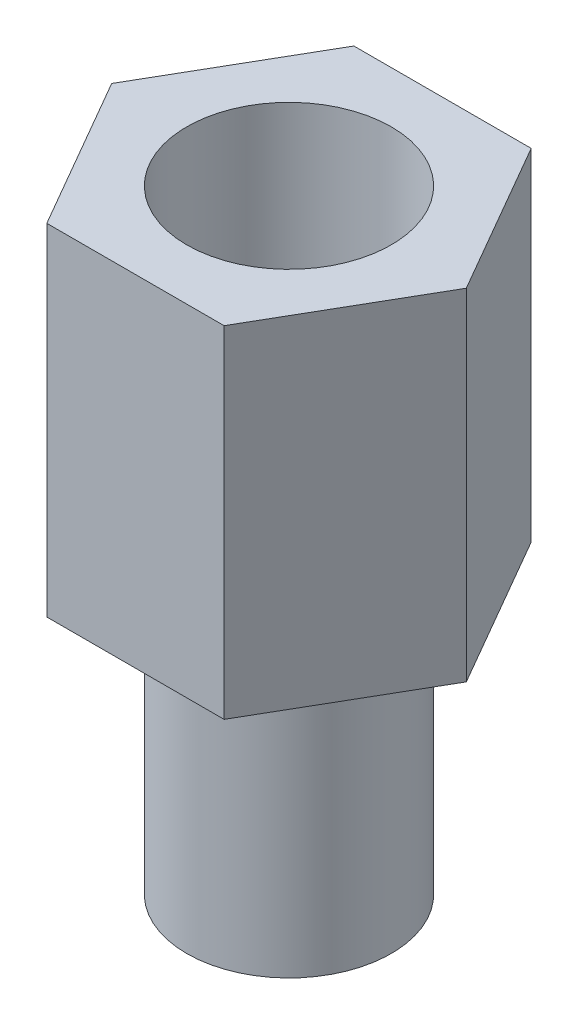
ISO-10303-21;
HEADER;
FILE_DESCRIPTION(('STEP AP214'),'2;1');
FILE_NAME('part.step','',(''),(''),'','','');
FILE_SCHEMA(('AUTOMOTIVE_DESIGN { 1 0 10303 214 1 1 1 1 }'));
ENDSEC;
DATA;
#1=APPLICATION_CONTEXT('core data for automotive mechanical design processes');
#2=APPLICATION_PROTOCOL_DEFINITION('international standard','automotive_design',2000,#1);
#3=PRODUCT_CONTEXT('',#1,'mechanical');
#4=PRODUCT('Part','Part','',(#3));
#5=PRODUCT_RELATED_PRODUCT_CATEGORY('part','',(#4));
#6=PRODUCT_DEFINITION_FORMATION('','',#4);
#7=PRODUCT_DEFINITION_CONTEXT('part definition',#1,'design');
#8=PRODUCT_DEFINITION('design','',#6,#7);
#9=PRODUCT_DEFINITION_SHAPE('','',#8);
#10=(LENGTH_UNIT() NAMED_UNIT(*) SI_UNIT(.MILLI.,.METRE.));
#11=(NAMED_UNIT(*) PLANE_ANGLE_UNIT() SI_UNIT($,.RADIAN.));
#12=(NAMED_UNIT(*) SI_UNIT($,.STERADIAN.) SOLID_ANGLE_UNIT());
#13=UNCERTAINTY_MEASURE_WITH_UNIT(LENGTH_MEASURE(1.E-05),#10,'distance_accuracy_value','');
#14=(GEOMETRIC_REPRESENTATION_CONTEXT(3) GLOBAL_UNCERTAINTY_ASSIGNED_CONTEXT((#13)) GLOBAL_UNIT_ASSIGNED_CONTEXT((#10,
#11,#12)) REPRESENTATION_CONTEXT('',''));
#15=CARTESIAN_POINT('',(0.,0.,0.));
#16=DIRECTION('',(0.,0.,1.));
#17=DIRECTION('',(1.,0.,0.));
#18=AXIS2_PLACEMENT_3D('',#15,#16,#17);
#19=CARTESIAN_POINT('',(1.3,5.,2.25166604983954));
#20=DIRECTION('',(-0.866025403784438,0.,-0.5));
#21=DIRECTION('',(-0.5,0.,0.866025403784439));
#22=AXIS2_PLACEMENT_3D('',#19,#20,#21);
#23=PLANE('',#22);
#24=DIRECTION('',(0.5,0.,-0.866025403784439));
#25=VECTOR('',#24,1.);
#26=CARTESIAN_POINT('',(1.3,0.,2.25166604983954));
#27=LINE('',#26,#25);
#28=CARTESIAN_POINT('',(1.3,0.,2.25166604983954));
#29=VERTEX_POINT('',#28);
#30=CARTESIAN_POINT('',(2.6,0.,0.));
#31=VERTEX_POINT('',#30);
#32=EDGE_CURVE('E129',#29,#31,#27,.T.);
#33=ORIENTED_EDGE('',*,*,#32,.T.);
#34=DIRECTION('',(0.,-1.,0.));
#35=VECTOR('',#34,1.);
#36=CARTESIAN_POINT('',(2.6,5.,0.));
#37=LINE('',#36,#35);
#38=CARTESIAN_POINT('',(2.6,5.,0.));
#39=VERTEX_POINT('',#38);
#40=EDGE_CURVE('E46',#39,#31,#37,.T.);
#41=ORIENTED_EDGE('',*,*,#40,.F.);
#42=DIRECTION('',(0.5,0.,-0.866025403784439));
#43=VECTOR('',#42,1.);
#44=CARTESIAN_POINT('',(1.3,5.,2.25166604983954));
#45=LINE('',#44,#43);
#46=CARTESIAN_POINT('',(1.3,5.,2.25166604983954));
#47=VERTEX_POINT('',#46);
#48=EDGE_CURVE('E140',#47,#39,#45,.T.);
#49=ORIENTED_EDGE('',*,*,#48,.F.);
#50=DIRECTION('',(0.,-1.,0.));
#51=VECTOR('',#50,1.);
#52=CARTESIAN_POINT('',(1.3,5.,2.25166604983954));
#53=LINE('',#52,#51);
#54=EDGE_CURVE('E125',#47,#29,#53,.T.);
#55=ORIENTED_EDGE('',*,*,#54,.T.);
#56=EDGE_LOOP('',(#33,#41,#49,#55));
#57=FACE_BOUND('',#56,.T.);
#58=ADVANCED_FACE('F43',(#57),#23,.F.);
#59=CARTESIAN_POINT('',(2.6,5.,0.));
#60=DIRECTION('',(-0.866025403784439,0.,0.5));
#61=DIRECTION('',(0.5,0.,0.866025403784439));
#62=AXIS2_PLACEMENT_3D('',#59,#60,#61);
#63=PLANE('',#62);
#64=DIRECTION('',(-0.5,0.,-0.866025403784439));
#65=VECTOR('',#64,1.);
#66=CARTESIAN_POINT('',(2.6,0.,0.));
#67=LINE('',#66,#65);
#68=CARTESIAN_POINT('',(1.29999999999999,0.,-2.25166604983955));
#69=VERTEX_POINT('',#68);
#70=EDGE_CURVE('E132',#31,#69,#67,.T.);
#71=ORIENTED_EDGE('',*,*,#70,.T.);
#72=DIRECTION('',(0.,-1.,0.));
#73=VECTOR('',#72,1.);
#74=CARTESIAN_POINT('',(1.29999999999999,5.,-2.25166604983955));
#75=LINE('',#74,#73);
#76=CARTESIAN_POINT('',(1.29999999999999,5.,-2.25166604983955));
#77=VERTEX_POINT('',#76);
#78=EDGE_CURVE('E143',#77,#69,#75,.T.);
#79=ORIENTED_EDGE('',*,*,#78,.F.);
#80=DIRECTION('',(-0.5,0.,-0.866025403784439));
#81=VECTOR('',#80,1.);
#82=CARTESIAN_POINT('',(2.6,5.,0.));
#83=LINE('',#82,#81);
#84=EDGE_CURVE('E98',#39,#77,#83,.T.);
#85=ORIENTED_EDGE('',*,*,#84,.F.);
#86=ORIENTED_EDGE('',*,*,#40,.T.);
#87=EDGE_LOOP('',(#71,#79,#85,#86));
#88=FACE_BOUND('',#87,.T.);
#89=ADVANCED_FACE('F148',(#88),#63,.F.);
#90=CARTESIAN_POINT('',(1.29999999999999,5.,-2.25166604983955));
#91=DIRECTION('',(0.,0.,1.));
#92=DIRECTION('',(1.,0.,0.));
#93=AXIS2_PLACEMENT_3D('',#90,#91,#92);
#94=PLANE('',#93);
#95=DIRECTION('',(-1.,0.,0.));
#96=VECTOR('',#95,1.);
#97=CARTESIAN_POINT('',(1.29999999999999,0.,-2.25166604983955));
#98=LINE('',#97,#96);
#99=CARTESIAN_POINT('',(-1.3,0.,-2.25166604983955));
#100=VERTEX_POINT('',#99);
#101=EDGE_CURVE('E135',#69,#100,#98,.T.);
#102=ORIENTED_EDGE('',*,*,#101,.T.);
#103=DIRECTION('',(0.,-1.,0.));
#104=VECTOR('',#103,1.);
#105=CARTESIAN_POINT('',(-1.3,5.,-2.25166604983955));
#106=LINE('',#105,#104);
#107=CARTESIAN_POINT('',(-1.3,5.,-2.25166604983955));
#108=VERTEX_POINT('',#107);
#109=EDGE_CURVE('E120',#108,#100,#106,.T.);
#110=ORIENTED_EDGE('',*,*,#109,.F.);
#111=DIRECTION('',(-1.,0.,0.));
#112=VECTOR('',#111,1.);
#113=CARTESIAN_POINT('',(1.29999999999999,5.,-2.25166604983955));
#114=LINE('',#113,#112);
#115=EDGE_CURVE('E111',#77,#108,#114,.T.);
#116=ORIENTED_EDGE('',*,*,#115,.F.);
#117=ORIENTED_EDGE('',*,*,#78,.T.);
#118=EDGE_LOOP('',(#102,#110,#116,#117));
#119=FACE_BOUND('',#118,.T.);
#120=ADVANCED_FACE('F154',(#119),#94,.F.);
#121=CARTESIAN_POINT('',(-1.3,5.,-2.25166604983955));
#122=DIRECTION('',(0.866025403784439,0.,0.5));
#123=DIRECTION('',(0.5,0.,-0.866025403784439));
#124=AXIS2_PLACEMENT_3D('',#121,#122,#123);
#125=PLANE('',#124);
#126=DIRECTION('',(-0.5,0.,0.866025403784439));
#127=VECTOR('',#126,1.);
#128=CARTESIAN_POINT('',(-1.3,0.,-2.25166604983955));
#129=LINE('',#128,#127);
#130=CARTESIAN_POINT('',(-2.6,0.,0.));
#131=VERTEX_POINT('',#130);
#132=EDGE_CURVE('E119',#100,#131,#129,.T.);
#133=ORIENTED_EDGE('',*,*,#132,.T.);
#134=DIRECTION('',(0.,-1.,0.));
#135=VECTOR('',#134,1.);
#136=CARTESIAN_POINT('',(-2.6,5.,0.));
#137=LINE('',#136,#135);
#138=CARTESIAN_POINT('',(-2.6,5.,0.));
#139=VERTEX_POINT('',#138);
#140=EDGE_CURVE('E116',#139,#131,#137,.T.);
#141=ORIENTED_EDGE('',*,*,#140,.F.);
#142=DIRECTION('',(-0.5,0.,0.866025403784439));
#143=VECTOR('',#142,1.);
#144=CARTESIAN_POINT('',(-1.3,5.,-2.25166604983955));
#145=LINE('',#144,#143);
#146=EDGE_CURVE('E105',#108,#139,#145,.T.);
#147=ORIENTED_EDGE('',*,*,#146,.F.);
#148=ORIENTED_EDGE('',*,*,#109,.T.);
#149=EDGE_LOOP('',(#133,#141,#147,#148));
#150=FACE_BOUND('',#149,.T.);
#151=ADVANCED_FACE('F117',(#150),#125,.F.);
#152=CARTESIAN_POINT('',(-2.6,5.,0.));
#153=DIRECTION('',(0.866025403784439,0.,-0.499999999999999));
#154=DIRECTION('',(-0.499999999999999,0.,-0.866025403784439));
#155=AXIS2_PLACEMENT_3D('',#152,#153,#154);
#156=PLANE('',#155);
#157=DIRECTION('',(0.499999999999999,0.,0.866025403784439));
#158=VECTOR('',#157,1.);
#159=CARTESIAN_POINT('',(-2.6,0.,0.));
#160=LINE('',#159,#158);
#161=CARTESIAN_POINT('',(-1.3,0.,2.25166604983954));
#162=VERTEX_POINT('',#161);
#163=EDGE_CURVE('E83',#131,#162,#160,.T.);
#164=ORIENTED_EDGE('',*,*,#163,.T.);
#165=DIRECTION('',(0.,-1.,0.));
#166=VECTOR('',#165,1.);
#167=CARTESIAN_POINT('',(-1.3,5.,2.25166604983954));
#168=LINE('',#167,#166);
#169=CARTESIAN_POINT('',(-1.3,5.,2.25166604983954));
#170=VERTEX_POINT('',#169);
#171=EDGE_CURVE('E121',#170,#162,#168,.T.);
#172=ORIENTED_EDGE('',*,*,#171,.F.);
#173=DIRECTION('',(0.499999999999999,0.,0.866025403784439));
#174=VECTOR('',#173,1.);
#175=CARTESIAN_POINT('',(-2.6,5.,0.));
#176=LINE('',#175,#174);
#177=EDGE_CURVE('E109',#139,#170,#176,.T.);
#178=ORIENTED_EDGE('',*,*,#177,.F.);
#179=ORIENTED_EDGE('',*,*,#140,.T.);
#180=EDGE_LOOP('',(#164,#172,#178,#179));
#181=FACE_BOUND('',#180,.T.);
#182=ADVANCED_FACE('F123',(#181),#156,.F.);
#183=CARTESIAN_POINT('',(-1.3,5.,2.25166604983954));
#184=DIRECTION('',(0.,0.,-1.));
#185=DIRECTION('',(-1.,0.,0.));
#186=AXIS2_PLACEMENT_3D('',#183,#184,#185);
#187=PLANE('',#186);
#188=DIRECTION('',(1.,0.,0.));
#189=VECTOR('',#188,1.);
#190=CARTESIAN_POINT('',(-1.3,0.,2.25166604983954));
#191=LINE('',#190,#189);
#192=EDGE_CURVE('E89',#162,#29,#191,.T.);
#193=ORIENTED_EDGE('',*,*,#192,.T.);
#194=ORIENTED_EDGE('',*,*,#54,.F.);
#195=DIRECTION('',(1.,0.,0.));
#196=VECTOR('',#195,1.);
#197=CARTESIAN_POINT('',(-1.3,5.,2.25166604983954));
#198=LINE('',#197,#196);
#199=EDGE_CURVE('E60',#170,#47,#198,.T.);
#200=ORIENTED_EDGE('',*,*,#199,.F.);
#201=ORIENTED_EDGE('',*,*,#171,.T.);
#202=EDGE_LOOP('',(#193,#194,#200,#201));
#203=FACE_BOUND('',#202,.T.);
#204=ADVANCED_FACE('F186',(#203),#187,.F.);
#205=CARTESIAN_POINT('',(0.,5.,0.));
#206=DIRECTION('',(0.,1.,0.));
#207=DIRECTION('',(0.,0.,1.));
#208=AXIS2_PLACEMENT_3D('',#205,#206,#207);
#209=PLANE('',#208);
#210=CARTESIAN_POINT('',(0.,5.,0.));
#211=DIRECTION('',(0.,1.,0.));
#212=DIRECTION('',(0.,0.,1.));
#213=AXIS2_PLACEMENT_3D('',#210,#211,#212);
#214=CIRCLE('',#213,1.5);
#215=CARTESIAN_POINT('',(0.,5.,1.5));
#216=VERTEX_POINT('',#215);
#217=EDGE_CURVE('E158',#216,#216,#214,.T.);
#218=ORIENTED_EDGE('',*,*,#217,.F.);
#219=EDGE_LOOP('',(#218));
#220=FACE_BOUND('',#219,.T.);
#221=ORIENTED_EDGE('',*,*,#48,.T.);
#222=ORIENTED_EDGE('',*,*,#84,.T.);
#223=ORIENTED_EDGE('',*,*,#115,.T.);
#224=ORIENTED_EDGE('',*,*,#146,.T.);
#225=ORIENTED_EDGE('',*,*,#177,.T.);
#226=ORIENTED_EDGE('',*,*,#199,.T.);
#227=EDGE_LOOP('',(#221,#222,#223,#224,#225,#226));
#228=FACE_BOUND('',#227,.T.);
#229=ADVANCED_FACE('F107',(#220,#228),#209,.T.);
#230=CARTESIAN_POINT('',(0.,0.,0.));
#231=DIRECTION('',(0.,1.,0.));
#232=DIRECTION('',(0.,0.,1.));
#233=AXIS2_PLACEMENT_3D('',#230,#231,#232);
#234=PLANE('',#233);
#235=CARTESIAN_POINT('',(0.,0.,0.));
#236=DIRECTION('',(0.,-1.,0.));
#237=DIRECTION('',(0.,0.,-1.));
#238=AXIS2_PLACEMENT_3D('',#235,#236,#237);
#239=CIRCLE('',#238,1.5);
#240=CARTESIAN_POINT('',(0.,0.,-1.5));
#241=VERTEX_POINT('',#240);
#242=EDGE_CURVE('E11',#241,#241,#239,.T.);
#243=ORIENTED_EDGE('',*,*,#242,.F.);
#244=EDGE_LOOP('',(#243));
#245=FACE_BOUND('',#244,.T.);
#246=ORIENTED_EDGE('',*,*,#32,.F.);
#247=ORIENTED_EDGE('',*,*,#192,.F.);
#248=ORIENTED_EDGE('',*,*,#163,.F.);
#249=ORIENTED_EDGE('',*,*,#132,.F.);
#250=ORIENTED_EDGE('',*,*,#101,.F.);
#251=ORIENTED_EDGE('',*,*,#70,.F.);
#252=EDGE_LOOP('',(#246,#247,#248,#249,#250,#251));
#253=FACE_BOUND('',#252,.T.);
#254=ADVANCED_FACE('F153',(#245,#253),#234,.F.);
#255=CARTESIAN_POINT('',(0.,1.5,0.));
#256=DIRECTION('',(0.,1.,0.));
#257=DIRECTION('',(0.,0.,1.));
#258=AXIS2_PLACEMENT_3D('',#255,#256,#257);
#259=CYLINDRICAL_SURFACE('',#258,1.5);
#260=CARTESIAN_POINT('',(0.,1.5,0.));
#261=DIRECTION('',(0.,1.,0.));
#262=DIRECTION('',(0.,0.,1.));
#263=AXIS2_PLACEMENT_3D('',#260,#261,#262);
#264=CIRCLE('',#263,1.5);
#265=CARTESIAN_POINT('',(0.,1.5,1.5));
#266=VERTEX_POINT('',#265);
#267=EDGE_CURVE('E133',#266,#266,#264,.T.);
#268=ORIENTED_EDGE('',*,*,#267,.F.);
#269=EDGE_LOOP('',(#268));
#270=FACE_BOUND('',#269,.T.);
#271=ORIENTED_EDGE('',*,*,#217,.T.);
#272=EDGE_LOOP('',(#271));
#273=FACE_BOUND('',#272,.T.);
#274=ADVANCED_FACE('F177',(#270,#273),#259,.F.);
#275=CARTESIAN_POINT('',(0.,1.5,0.));
#276=DIRECTION('',(0.,1.,0.));
#277=DIRECTION('',(0.,0.,1.));
#278=AXIS2_PLACEMENT_3D('',#275,#276,#277);
#279=PLANE('',#278);
#280=ORIENTED_EDGE('',*,*,#267,.T.);
#281=EDGE_LOOP('',(#280));
#282=FACE_BOUND('',#281,.T.);
#283=ADVANCED_FACE('F172',(#282),#279,.T.);
#284=CARTESIAN_POINT('',(0.,-4.,0.));
#285=DIRECTION('',(0.,1.,0.));
#286=DIRECTION('',(0.,0.,1.));
#287=AXIS2_PLACEMENT_3D('',#284,#285,#286);
#288=CYLINDRICAL_SURFACE('',#287,1.5);
#289=CARTESIAN_POINT('',(0.,-4.,0.));
#290=DIRECTION('',(0.,-1.,0.));
#291=DIRECTION('',(0.,0.,-1.));
#292=AXIS2_PLACEMENT_3D('',#289,#290,#291);
#293=CIRCLE('',#292,1.5);
#294=CARTESIAN_POINT('',(0.,-4.,-1.5));
#295=VERTEX_POINT('',#294);
#296=EDGE_CURVE('E161',#295,#295,#293,.T.);
#297=ORIENTED_EDGE('',*,*,#296,.F.);
#298=EDGE_LOOP('',(#297));
#299=FACE_BOUND('',#298,.T.);
#300=ORIENTED_EDGE('',*,*,#242,.T.);
#301=EDGE_LOOP('',(#300));
#302=FACE_BOUND('',#301,.T.);
#303=ADVANCED_FACE('F169',(#299,#302),#288,.T.);
#304=CARTESIAN_POINT('',(0.,-4.,0.));
#305=DIRECTION('',(0.,-1.,0.));
#306=DIRECTION('',(0.,0.,-1.));
#307=AXIS2_PLACEMENT_3D('',#304,#305,#306);
#308=PLANE('',#307);
#309=ORIENTED_EDGE('',*,*,#296,.T.);
#310=EDGE_LOOP('',(#309));
#311=FACE_BOUND('',#310,.T.);
#312=ADVANCED_FACE('F167',(#311),#308,.T.);
#313=CLOSED_SHELL('',(#58,#89,#120,#151,#182,#204,#229,#254,#274,#283,#303,#312));
#314=MANIFOLD_SOLID_BREP('B2',#313);
#315=ADVANCED_BREP_SHAPE_REPRESENTATION('',(#18,#314),#14);
#316=SHAPE_DEFINITION_REPRESENTATION(#9,#315);
ENDSEC;
END-ISO-10303-21;
